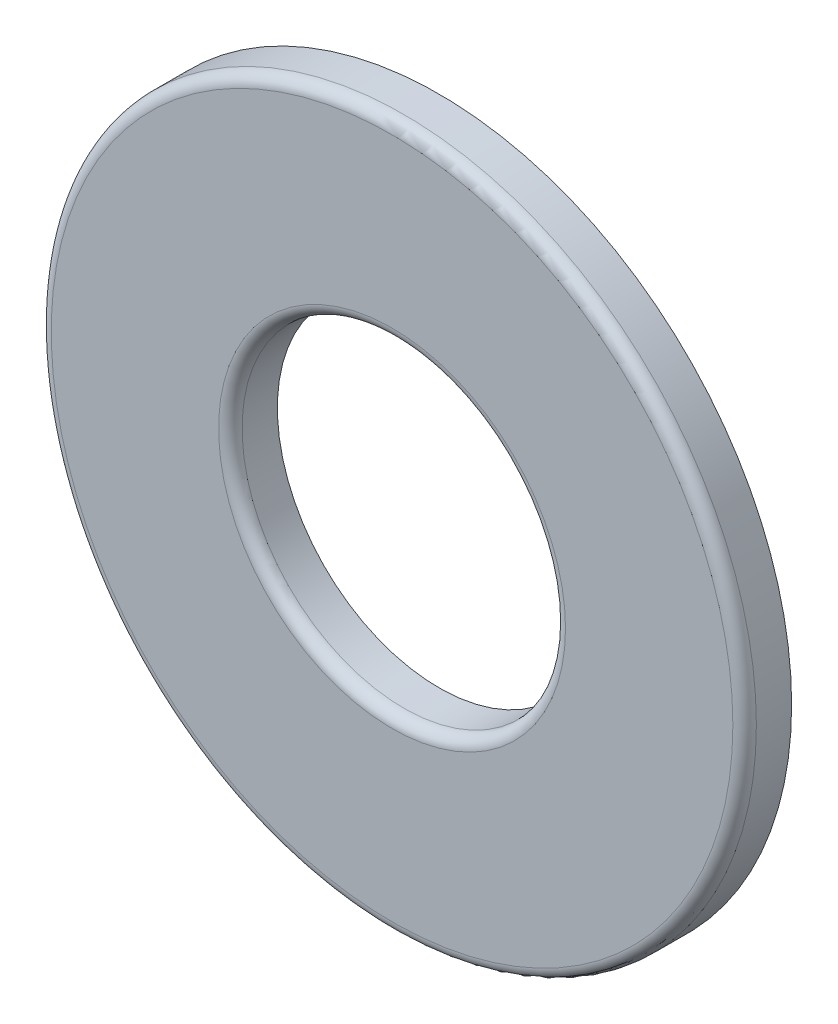
ISO-10303-21;
HEADER;
FILE_DESCRIPTION(('STEP AP214'),'2;1');
FILE_NAME('part.step','',(''),(''),'','','');
FILE_SCHEMA(('AUTOMOTIVE_DESIGN { 1 0 10303 214 1 1 1 1 }'));
ENDSEC;
DATA;
#1=APPLICATION_CONTEXT('core data for automotive mechanical design processes');
#2=APPLICATION_PROTOCOL_DEFINITION('international standard','automotive_design',2000,#1);
#3=PRODUCT_CONTEXT('',#1,'mechanical');
#4=PRODUCT('Part','Part','',(#3));
#5=PRODUCT_RELATED_PRODUCT_CATEGORY('part','',(#4));
#6=PRODUCT_DEFINITION_FORMATION('','',#4);
#7=PRODUCT_DEFINITION_CONTEXT('part definition',#1,'design');
#8=PRODUCT_DEFINITION('design','',#6,#7);
#9=PRODUCT_DEFINITION_SHAPE('','',#8);
#10=(LENGTH_UNIT() NAMED_UNIT(*) SI_UNIT(.MILLI.,.METRE.));
#11=(NAMED_UNIT(*) PLANE_ANGLE_UNIT() SI_UNIT($,.RADIAN.));
#12=(NAMED_UNIT(*) SI_UNIT($,.STERADIAN.) SOLID_ANGLE_UNIT());
#13=UNCERTAINTY_MEASURE_WITH_UNIT(LENGTH_MEASURE(1.E-05),#10,'distance_accuracy_value','');
#14=(GEOMETRIC_REPRESENTATION_CONTEXT(3) GLOBAL_UNCERTAINTY_ASSIGNED_CONTEXT((#13)) GLOBAL_UNIT_ASSIGNED_CONTEXT((#10,
#11,#12)) REPRESENTATION_CONTEXT('',''));
#15=CARTESIAN_POINT('',(0.,0.,0.));
#16=DIRECTION('',(0.,0.,1.));
#17=DIRECTION('',(1.,0.,0.));
#18=AXIS2_PLACEMENT_3D('',#15,#16,#17);
#19=CARTESIAN_POINT('',(0.,0.,0.634999999999997));
#20=DIRECTION('',(0.,0.,1.));
#21=DIRECTION('',(1.,0.,0.));
#22=AXIS2_PLACEMENT_3D('',#19,#20,#21);
#23=PLANE('',#22);
#24=CARTESIAN_POINT('',(0.,0.,0.634999999999997));
#25=DIRECTION('',(0.,0.,1.));
#26=DIRECTION('',(1.,0.,0.));
#27=AXIS2_PLACEMENT_3D('',#24,#25,#26);
#28=CIRCLE('',#27,9.2075);
#29=CARTESIAN_POINT('',(9.2075,0.,0.634999999999997));
#30=VERTEX_POINT('',#29);
#31=EDGE_CURVE('E46',#30,#30,#28,.T.);
#32=ORIENTED_EDGE('',*,*,#31,.T.);
#33=EDGE_LOOP('',(#32));
#34=FACE_BOUND('',#33,.T.);
#35=CARTESIAN_POINT('',(0.,0.,0.634999999999997));
#36=DIRECTION('',(0.,0.,1.));
#37=DIRECTION('',(1.,0.,0.));
#38=AXIS2_PLACEMENT_3D('',#35,#36,#37);
#39=CIRCLE('',#38,4.6863);
#40=CARTESIAN_POINT('',(4.6863,0.,0.634999999999997));
#41=VERTEX_POINT('',#40);
#42=EDGE_CURVE('E50',#41,#41,#39,.F.);
#43=ORIENTED_EDGE('',*,*,#42,.T.);
#44=EDGE_LOOP('',(#43));
#45=FACE_BOUND('',#44,.T.);
#46=ADVANCED_FACE('F35',(#34,#45),#23,.T.);
#47=CARTESIAN_POINT('',(0.,0.,0.634999999999997));
#48=DIRECTION('',(0.,0.,-1.));
#49=DIRECTION('',(-1.,0.,0.));
#50=AXIS2_PLACEMENT_3D('',#47,#48,#49);
#51=CYLINDRICAL_SURFACE('',#50,9.525);
#52=CARTESIAN_POINT('',(0.,0.,0.317499999999997));
#53=DIRECTION('',(0.,0.,1.));
#54=DIRECTION('',(1.,0.,0.));
#55=AXIS2_PLACEMENT_3D('',#52,#53,#54);
#56=CIRCLE('',#55,9.525);
#57=CARTESIAN_POINT('',(9.525,0.,0.317499999999997));
#58=VERTEX_POINT('',#57);
#59=EDGE_CURVE('E42',#58,#58,#56,.F.);
#60=ORIENTED_EDGE('',*,*,#59,.T.);
#61=EDGE_LOOP('',(#60));
#62=FACE_BOUND('',#61,.T.);
#63=CARTESIAN_POINT('',(0.,0.,-0.635000000000003));
#64=DIRECTION('',(0.,0.,1.));
#65=DIRECTION('',(1.,0.,0.));
#66=AXIS2_PLACEMENT_3D('',#63,#64,#65);
#67=CIRCLE('',#66,9.525);
#68=CARTESIAN_POINT('',(9.525,0.,-0.635000000000003));
#69=VERTEX_POINT('',#68);
#70=EDGE_CURVE('E55',#69,#69,#67,.T.);
#71=ORIENTED_EDGE('',*,*,#70,.T.);
#72=EDGE_LOOP('',(#71));
#73=FACE_BOUND('',#72,.T.);
#74=ADVANCED_FACE('F67',(#62,#73),#51,.T.);
#75=CARTESIAN_POINT('',(0.,0.,0.634999999999997));
#76=DIRECTION('',(0.,0.,-1.));
#77=DIRECTION('',(-1.,0.,0.));
#78=AXIS2_PLACEMENT_3D('',#75,#76,#77);
#79=CYLINDRICAL_SURFACE('',#78,4.3688);
#80=CARTESIAN_POINT('',(0.,0.,0.317499999999997));
#81=DIRECTION('',(0.,0.,1.));
#82=DIRECTION('',(1.,0.,0.));
#83=AXIS2_PLACEMENT_3D('',#80,#81,#82);
#84=CIRCLE('',#83,4.3688);
#85=CARTESIAN_POINT('',(4.3688,0.,0.317499999999997));
#86=VERTEX_POINT('',#85);
#87=EDGE_CURVE('E10',#86,#86,#84,.T.);
#88=ORIENTED_EDGE('',*,*,#87,.T.);
#89=EDGE_LOOP('',(#88));
#90=FACE_BOUND('',#89,.T.);
#91=CARTESIAN_POINT('',(0.,0.,-0.635000000000003));
#92=DIRECTION('',(0.,0.,1.));
#93=DIRECTION('',(1.,0.,0.));
#94=AXIS2_PLACEMENT_3D('',#91,#92,#93);
#95=CIRCLE('',#94,4.3688);
#96=CARTESIAN_POINT('',(4.3688,0.,-0.635000000000003));
#97=VERTEX_POINT('',#96);
#98=EDGE_CURVE('E58',#97,#97,#95,.T.);
#99=ORIENTED_EDGE('',*,*,#98,.F.);
#100=EDGE_LOOP('',(#99));
#101=FACE_BOUND('',#100,.T.);
#102=ADVANCED_FACE('F65',(#90,#101),#79,.F.);
#103=CARTESIAN_POINT('',(0.,0.,-0.635000000000003));
#104=DIRECTION('',(0.,0.,1.));
#105=DIRECTION('',(1.,0.,0.));
#106=AXIS2_PLACEMENT_3D('',#103,#104,#105);
#107=PLANE('',#106);
#108=ORIENTED_EDGE('',*,*,#98,.T.);
#109=EDGE_LOOP('',(#108));
#110=FACE_BOUND('',#109,.T.);
#111=ORIENTED_EDGE('',*,*,#70,.F.);
#112=EDGE_LOOP('',(#111));
#113=FACE_BOUND('',#112,.T.);
#114=ADVANCED_FACE('F62',(#110,#113),#107,.F.);
#115=CARTESIAN_POINT('',(0.,0.,0.317499999999997));
#116=DIRECTION('',(0.,0.,1.));
#117=DIRECTION('',(1.,0.,0.));
#118=AXIS2_PLACEMENT_3D('',#115,#116,#117);
#119=TOROIDAL_SURFACE('',#118,9.2075,0.3175);
#120=ORIENTED_EDGE('',*,*,#59,.F.);
#121=EDGE_LOOP('',(#120));
#122=FACE_BOUND('',#121,.T.);
#123=ORIENTED_EDGE('',*,*,#31,.F.);
#124=EDGE_LOOP('',(#123));
#125=FACE_BOUND('',#124,.T.);
#126=ADVANCED_FACE('F73',(#122,#125),#119,.T.);
#127=CARTESIAN_POINT('',(0.,0.,0.317499999999997));
#128=DIRECTION('',(0.,0.,1.));
#129=DIRECTION('',(1.,0.,0.));
#130=AXIS2_PLACEMENT_3D('',#127,#128,#129);
#131=TOROIDAL_SURFACE('',#130,4.6863,0.3175);
#132=ORIENTED_EDGE('',*,*,#42,.F.);
#133=EDGE_LOOP('',(#132));
#134=FACE_BOUND('',#133,.T.);
#135=ORIENTED_EDGE('',*,*,#87,.F.);
#136=EDGE_LOOP('',(#135));
#137=FACE_BOUND('',#136,.T.);
#138=ADVANCED_FACE('F37',(#134,#137),#131,.T.);
#139=CLOSED_SHELL('',(#46,#74,#102,#114,#126,#138));
#140=MANIFOLD_SOLID_BREP('B2',#139);
#141=ADVANCED_BREP_SHAPE_REPRESENTATION('',(#18,#140),#14);
#142=SHAPE_DEFINITION_REPRESENTATION(#9,#141);
ENDSEC;
END-ISO-10303-21;
